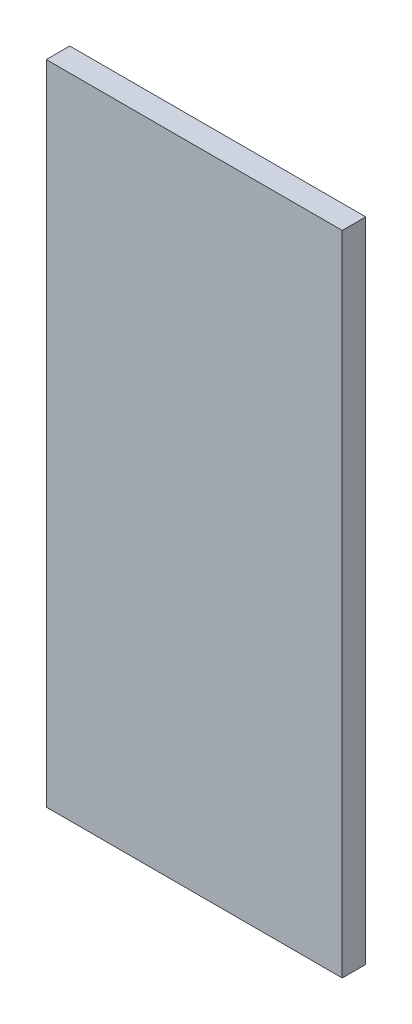
ISO-10303-21;
HEADER;
FILE_DESCRIPTION(('STEP AP214'),'2;1');
FILE_NAME('part.step','',(''),(''),'','','');
FILE_SCHEMA(('AUTOMOTIVE_DESIGN { 1 0 10303 214 1 1 1 1 }'));
ENDSEC;
DATA;
#1=APPLICATION_CONTEXT('core data for automotive mechanical design processes');
#2=APPLICATION_PROTOCOL_DEFINITION('international standard','automotive_design',2000,#1);
#3=PRODUCT_CONTEXT('',#1,'mechanical');
#4=PRODUCT('Part','Part','',(#3));
#5=PRODUCT_RELATED_PRODUCT_CATEGORY('part','',(#4));
#6=PRODUCT_DEFINITION_FORMATION('','',#4);
#7=PRODUCT_DEFINITION_CONTEXT('part definition',#1,'design');
#8=PRODUCT_DEFINITION('design','',#6,#7);
#9=PRODUCT_DEFINITION_SHAPE('','',#8);
#10=(LENGTH_UNIT() NAMED_UNIT(*) SI_UNIT(.MILLI.,.METRE.));
#11=(NAMED_UNIT(*) PLANE_ANGLE_UNIT() SI_UNIT($,.RADIAN.));
#12=(NAMED_UNIT(*) SI_UNIT($,.STERADIAN.) SOLID_ANGLE_UNIT());
#13=UNCERTAINTY_MEASURE_WITH_UNIT(LENGTH_MEASURE(1.E-05),#10,'distance_accuracy_value','');
#14=(GEOMETRIC_REPRESENTATION_CONTEXT(3) GLOBAL_UNCERTAINTY_ASSIGNED_CONTEXT((#13)) GLOBAL_UNIT_ASSIGNED_CONTEXT((#10,
#11,#12)) REPRESENTATION_CONTEXT('',''));
#15=CARTESIAN_POINT('',(0.,0.,0.));
#16=DIRECTION('',(0.,0.,1.));
#17=DIRECTION('',(1.,0.,0.));
#18=AXIS2_PLACEMENT_3D('',#15,#16,#17);
#19=CARTESIAN_POINT('',(80.,-175.,12.7));
#20=DIRECTION('',(-1.,0.,0.));
#21=DIRECTION('',(0.,0.,1.));
#22=AXIS2_PLACEMENT_3D('',#19,#20,#21);
#23=PLANE('',#22);
#24=DIRECTION('',(0.,1.,0.));
#25=VECTOR('',#24,1.);
#26=CARTESIAN_POINT('',(80.,-175.,0.));
#27=LINE('',#26,#25);
#28=CARTESIAN_POINT('',(80.,-175.,0.));
#29=VERTEX_POINT('',#28);
#30=CARTESIAN_POINT('',(80.,175.,0.));
#31=VERTEX_POINT('',#30);
#32=EDGE_CURVE('E96',#29,#31,#27,.T.);
#33=ORIENTED_EDGE('',*,*,#32,.T.);
#34=DIRECTION('',(0.,0.,-1.));
#35=VECTOR('',#34,1.);
#36=CARTESIAN_POINT('',(80.,175.,12.7));
#37=LINE('',#36,#35);
#38=CARTESIAN_POINT('',(80.,175.,12.7));
#39=VERTEX_POINT('',#38);
#40=EDGE_CURVE('E11',#39,#31,#37,.T.);
#41=ORIENTED_EDGE('',*,*,#40,.F.);
#42=DIRECTION('',(0.,1.,0.));
#43=VECTOR('',#42,1.);
#44=CARTESIAN_POINT('',(80.,-175.,12.7));
#45=LINE('',#44,#43);
#46=CARTESIAN_POINT('',(80.,-175.,12.7));
#47=VERTEX_POINT('',#46);
#48=EDGE_CURVE('E84',#47,#39,#45,.T.);
#49=ORIENTED_EDGE('',*,*,#48,.F.);
#50=DIRECTION('',(0.,0.,-1.));
#51=VECTOR('',#50,1.);
#52=CARTESIAN_POINT('',(80.,-175.,12.7));
#53=LINE('',#52,#51);
#54=EDGE_CURVE('E92',#47,#29,#53,.T.);
#55=ORIENTED_EDGE('',*,*,#54,.T.);
#56=EDGE_LOOP('',(#33,#41,#49,#55));
#57=FACE_BOUND('',#56,.T.);
#58=ADVANCED_FACE('F33',(#57),#23,.F.);
#59=CARTESIAN_POINT('',(-80.,175.,12.7));
#60=DIRECTION('',(0.,-1.,0.));
#61=DIRECTION('',(0.,0.,-1.));
#62=AXIS2_PLACEMENT_3D('',#59,#60,#61);
#63=PLANE('',#62);
#64=DIRECTION('',(-1.,0.,0.));
#65=VECTOR('',#64,1.);
#66=CARTESIAN_POINT('',(-80.,175.,0.));
#67=LINE('',#66,#65);
#68=CARTESIAN_POINT('',(-80.,175.,0.));
#69=VERTEX_POINT('',#68);
#70=EDGE_CURVE('E88',#31,#69,#67,.T.);
#71=ORIENTED_EDGE('',*,*,#70,.T.);
#72=DIRECTION('',(0.,0.,-1.));
#73=VECTOR('',#72,1.);
#74=CARTESIAN_POINT('',(-80.,175.,12.7));
#75=LINE('',#74,#73);
#76=CARTESIAN_POINT('',(-80.,175.,12.7));
#77=VERTEX_POINT('',#76);
#78=EDGE_CURVE('E41',#77,#69,#75,.T.);
#79=ORIENTED_EDGE('',*,*,#78,.F.);
#80=DIRECTION('',(-1.,0.,0.));
#81=VECTOR('',#80,1.);
#82=CARTESIAN_POINT('',(-80.,175.,12.7));
#83=LINE('',#82,#81);
#84=EDGE_CURVE('E79',#39,#77,#83,.T.);
#85=ORIENTED_EDGE('',*,*,#84,.F.);
#86=ORIENTED_EDGE('',*,*,#40,.T.);
#87=EDGE_LOOP('',(#71,#79,#85,#86));
#88=FACE_BOUND('',#87,.T.);
#89=ADVANCED_FACE('F87',(#88),#63,.F.);
#90=CARTESIAN_POINT('',(-80.,-175.,12.7));
#91=DIRECTION('',(1.,0.,0.));
#92=DIRECTION('',(0.,0.,-1.));
#93=AXIS2_PLACEMENT_3D('',#90,#91,#92);
#94=PLANE('',#93);
#95=DIRECTION('',(0.,-1.,0.));
#96=VECTOR('',#95,1.);
#97=CARTESIAN_POINT('',(-80.,-175.,0.));
#98=LINE('',#97,#96);
#99=CARTESIAN_POINT('',(-80.,-175.,0.));
#100=VERTEX_POINT('',#99);
#101=EDGE_CURVE('E66',#69,#100,#98,.T.);
#102=ORIENTED_EDGE('',*,*,#101,.T.);
#103=DIRECTION('',(0.,0.,-1.));
#104=VECTOR('',#103,1.);
#105=CARTESIAN_POINT('',(-80.,-175.,12.7));
#106=LINE('',#105,#104);
#107=CARTESIAN_POINT('',(-80.,-175.,12.7));
#108=VERTEX_POINT('',#107);
#109=EDGE_CURVE('E89',#108,#100,#106,.T.);
#110=ORIENTED_EDGE('',*,*,#109,.F.);
#111=DIRECTION('',(0.,-1.,0.));
#112=VECTOR('',#111,1.);
#113=CARTESIAN_POINT('',(-80.,-175.,12.7));
#114=LINE('',#113,#112);
#115=EDGE_CURVE('E82',#77,#108,#114,.T.);
#116=ORIENTED_EDGE('',*,*,#115,.F.);
#117=ORIENTED_EDGE('',*,*,#78,.T.);
#118=EDGE_LOOP('',(#102,#110,#116,#117));
#119=FACE_BOUND('',#118,.T.);
#120=ADVANCED_FACE('F90',(#119),#94,.F.);
#121=CARTESIAN_POINT('',(-80.,-175.,12.7));
#122=DIRECTION('',(0.,1.,0.));
#123=DIRECTION('',(0.,0.,1.));
#124=AXIS2_PLACEMENT_3D('',#121,#122,#123);
#125=PLANE('',#124);
#126=DIRECTION('',(1.,0.,0.));
#127=VECTOR('',#126,1.);
#128=CARTESIAN_POINT('',(-80.,-175.,0.));
#129=LINE('',#128,#127);
#130=EDGE_CURVE('E72',#100,#29,#129,.T.);
#131=ORIENTED_EDGE('',*,*,#130,.T.);
#132=ORIENTED_EDGE('',*,*,#54,.F.);
#133=DIRECTION('',(1.,0.,0.));
#134=VECTOR('',#133,1.);
#135=CARTESIAN_POINT('',(-80.,-175.,12.7));
#136=LINE('',#135,#134);
#137=EDGE_CURVE('E49',#108,#47,#136,.T.);
#138=ORIENTED_EDGE('',*,*,#137,.F.);
#139=ORIENTED_EDGE('',*,*,#109,.T.);
#140=EDGE_LOOP('',(#131,#132,#138,#139));
#141=FACE_BOUND('',#140,.T.);
#142=ADVANCED_FACE('F103',(#141),#125,.F.);
#143=CARTESIAN_POINT('',(0.,0.,12.7));
#144=DIRECTION('',(0.,0.,-1.));
#145=DIRECTION('',(-1.,0.,0.));
#146=AXIS2_PLACEMENT_3D('',#143,#144,#145);
#147=PLANE('',#146);
#148=ORIENTED_EDGE('',*,*,#48,.T.);
#149=ORIENTED_EDGE('',*,*,#84,.T.);
#150=ORIENTED_EDGE('',*,*,#115,.T.);
#151=ORIENTED_EDGE('',*,*,#137,.T.);
#152=EDGE_LOOP('',(#148,#149,#150,#151));
#153=FACE_BOUND('',#152,.T.);
#154=ADVANCED_FACE('F80',(#153),#147,.F.);
#155=CARTESIAN_POINT('',(0.,0.,0.));
#156=DIRECTION('',(0.,0.,-1.));
#157=DIRECTION('',(-1.,0.,0.));
#158=AXIS2_PLACEMENT_3D('',#155,#156,#157);
#159=PLANE('',#158);
#160=ORIENTED_EDGE('',*,*,#32,.F.);
#161=ORIENTED_EDGE('',*,*,#130,.F.);
#162=ORIENTED_EDGE('',*,*,#101,.F.);
#163=ORIENTED_EDGE('',*,*,#70,.F.);
#164=EDGE_LOOP('',(#160,#161,#162,#163));
#165=FACE_BOUND('',#164,.T.);
#166=ADVANCED_FACE('F106',(#165),#159,.T.);
#167=CLOSED_SHELL('',(#58,#89,#120,#142,#154,#166));
#168=MANIFOLD_SOLID_BREP('B2',#167);
#169=ADVANCED_BREP_SHAPE_REPRESENTATION('',(#18,#168),#14);
#170=SHAPE_DEFINITION_REPRESENTATION(#9,#169);
ENDSEC;
END-ISO-10303-21;
